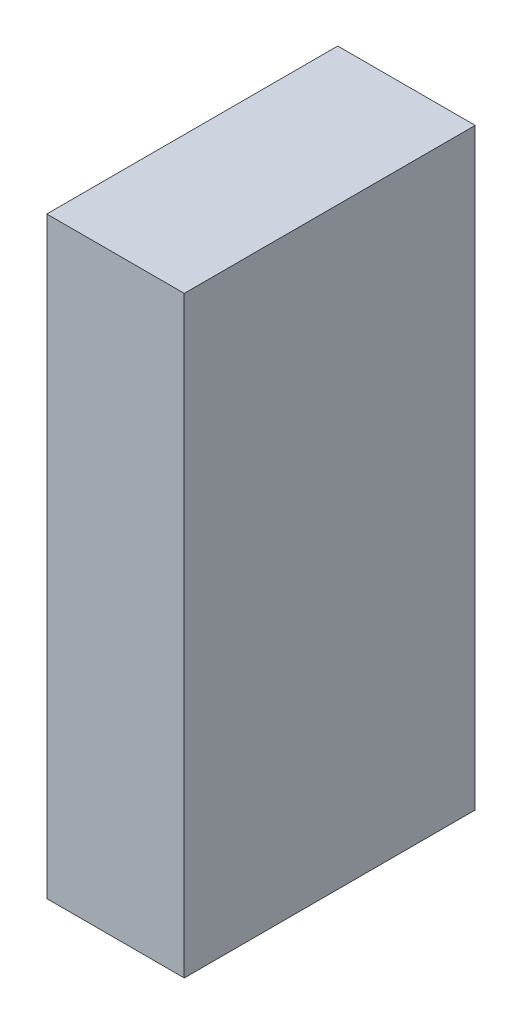
ISO-10303-21;
HEADER;
FILE_DESCRIPTION(('STEP AP214'),'2;1');
FILE_NAME('part.step','',(''),(''),'','','');
FILE_SCHEMA(('AUTOMOTIVE_DESIGN { 1 0 10303 214 1 1 1 1 }'));
ENDSEC;
DATA;
#1=APPLICATION_CONTEXT('core data for automotive mechanical design processes');
#2=APPLICATION_PROTOCOL_DEFINITION('international standard','automotive_design',2000,#1);
#3=PRODUCT_CONTEXT('',#1,'mechanical');
#4=PRODUCT('Part','Part','',(#3));
#5=PRODUCT_RELATED_PRODUCT_CATEGORY('part','',(#4));
#6=PRODUCT_DEFINITION_FORMATION('','',#4);
#7=PRODUCT_DEFINITION_CONTEXT('part definition',#1,'design');
#8=PRODUCT_DEFINITION('design','',#6,#7);
#9=PRODUCT_DEFINITION_SHAPE('','',#8);
#10=(LENGTH_UNIT() NAMED_UNIT(*) SI_UNIT(.MILLI.,.METRE.));
#11=(NAMED_UNIT(*) PLANE_ANGLE_UNIT() SI_UNIT($,.RADIAN.));
#12=(NAMED_UNIT(*) SI_UNIT($,.STERADIAN.) SOLID_ANGLE_UNIT());
#13=UNCERTAINTY_MEASURE_WITH_UNIT(LENGTH_MEASURE(1.E-05),#10,'distance_accuracy_value','');
#14=(GEOMETRIC_REPRESENTATION_CONTEXT(3) GLOBAL_UNCERTAINTY_ASSIGNED_CONTEXT((#13)) GLOBAL_UNIT_ASSIGNED_CONTEXT((#10,
#11,#12)) REPRESENTATION_CONTEXT('',''));
#15=CARTESIAN_POINT('',(0.,0.,0.));
#16=DIRECTION('',(0.,0.,1.));
#17=DIRECTION('',(1.,0.,0.));
#18=AXIS2_PLACEMENT_3D('',#15,#16,#17);
#19=CARTESIAN_POINT('',(49.28,-47.82,2.75));
#20=DIRECTION('',(0.,0.,-1.));
#21=DIRECTION('',(-1.,0.,0.));
#22=AXIS2_PLACEMENT_3D('',#19,#20,#21);
#23=PLANE('',#22);
#24=DIRECTION('',(0.,1.,0.));
#25=VECTOR('',#24,1.);
#26=CARTESIAN_POINT('',(-16.9754999999996,1.51000000000001,2.75));
#27=LINE('',#26,#25);
#28=CARTESIAN_POINT('',(-16.9754999999996,1.51000000000001,2.74999999999997));
#29=VERTEX_POINT('',#28);
#30=CARTESIAN_POINT('',(-16.9754999999996,14.45,2.75));
#31=VERTEX_POINT('',#30);
#32=EDGE_CURVE('E80',#29,#31,#27,.T.);
#33=ORIENTED_EDGE('',*,*,#32,.F.);
#34=DIRECTION('',(1.,0.,0.));
#35=VECTOR('',#34,1.);
#36=CARTESIAN_POINT('',(-19.9754999999996,1.51000000000001,2.75));
#37=LINE('',#36,#35);
#38=CARTESIAN_POINT('',(-19.9754999999996,1.51000000000001,2.75));
#39=VERTEX_POINT('',#38);
#40=EDGE_CURVE('E75',#39,#29,#37,.T.);
#41=ORIENTED_EDGE('',*,*,#40,.F.);
#42=DIRECTION('',(0.,-1.,0.));
#43=VECTOR('',#42,1.);
#44=CARTESIAN_POINT('',(-19.9754999999996,1.51000000000001,2.75));
#45=LINE('',#44,#43);
#46=CARTESIAN_POINT('',(-19.9754999999996,14.45,2.74999999999997));
#47=VERTEX_POINT('',#46);
#48=EDGE_CURVE('E98',#47,#39,#45,.T.);
#49=ORIENTED_EDGE('',*,*,#48,.F.);
#50=DIRECTION('',(-1.,0.,0.));
#51=VECTOR('',#50,1.);
#52=CARTESIAN_POINT('',(-19.9754999999996,14.45,2.75));
#53=LINE('',#52,#51);
#54=EDGE_CURVE('E95',#31,#47,#53,.T.);
#55=ORIENTED_EDGE('',*,*,#54,.F.);
#56=EDGE_LOOP('',(#33,#41,#49,#55));
#57=FACE_BOUND('',#56,.T.);
#58=ADVANCED_FACE('F34',(#57),#23,.T.);
#59=CARTESIAN_POINT('',(-19.9754999999996,1.51000000000001,22.3832074439874));
#60=DIRECTION('',(1.,0.,0.));
#61=DIRECTION('',(0.,0.,-1.));
#62=AXIS2_PLACEMENT_3D('',#59,#60,#61);
#63=PLANE('',#62);
#64=DIRECTION('',(0.,-1.,0.));
#65=VECTOR('',#64,1.);
#66=CARTESIAN_POINT('',(-19.9754999999996,1.51000000000001,9.10000000000012));
#67=LINE('',#66,#65);
#68=CARTESIAN_POINT('',(-19.9754999999996,14.45,9.10000000000012));
#69=VERTEX_POINT('',#68);
#70=CARTESIAN_POINT('',(-19.9754999999996,1.51000000000001,9.10000000000012));
#71=VERTEX_POINT('',#70);
#72=EDGE_CURVE('E13',#69,#71,#67,.T.);
#73=ORIENTED_EDGE('',*,*,#72,.F.);
#74=DIRECTION('',(0.,0.,-1.));
#75=VECTOR('',#74,1.);
#76=CARTESIAN_POINT('',(-19.9754999999996,14.45,22.3832074439874));
#77=LINE('',#76,#75);
#78=EDGE_CURVE('E96',#69,#47,#77,.T.);
#79=ORIENTED_EDGE('',*,*,#78,.T.);
#80=ORIENTED_EDGE('',*,*,#48,.T.);
#81=DIRECTION('',(0.,0.,-1.));
#82=VECTOR('',#81,1.);
#83=CARTESIAN_POINT('',(-19.9754999999996,1.51000000000001,22.3832074439874));
#84=LINE('',#83,#82);
#85=EDGE_CURVE('E51',#71,#39,#84,.T.);
#86=ORIENTED_EDGE('',*,*,#85,.F.);
#87=EDGE_LOOP('',(#73,#79,#80,#86));
#88=FACE_BOUND('',#87,.T.);
#89=ADVANCED_FACE('F108',(#88),#63,.F.);
#90=CARTESIAN_POINT('',(-16.9754999999996,1.51000000000001,22.3832074439874));
#91=DIRECTION('',(-1.,0.,0.));
#92=DIRECTION('',(0.,0.,1.));
#93=AXIS2_PLACEMENT_3D('',#90,#91,#92);
#94=PLANE('',#93);
#95=DIRECTION('',(0.,1.,0.));
#96=VECTOR('',#95,1.);
#97=CARTESIAN_POINT('',(-16.9754999999996,1.51000000000001,9.10000000000012));
#98=LINE('',#97,#96);
#99=CARTESIAN_POINT('',(-16.9754999999996,1.51000000000001,9.10000000000012));
#100=VERTEX_POINT('',#99);
#101=CARTESIAN_POINT('',(-16.9754999999996,14.45,9.10000000000012));
#102=VERTEX_POINT('',#101);
#103=EDGE_CURVE('E44',#100,#102,#98,.T.);
#104=ORIENTED_EDGE('',*,*,#103,.F.);
#105=DIRECTION('',(0.,0.,-1.));
#106=VECTOR('',#105,1.);
#107=CARTESIAN_POINT('',(-16.9754999999996,1.51000000000001,22.3832074439874));
#108=LINE('',#107,#106);
#109=EDGE_CURVE('E38',#100,#29,#108,.T.);
#110=ORIENTED_EDGE('',*,*,#109,.T.);
#111=ORIENTED_EDGE('',*,*,#32,.T.);
#112=DIRECTION('',(0.,0.,-1.));
#113=VECTOR('',#112,1.);
#114=CARTESIAN_POINT('',(-16.9754999999996,14.45,22.3832074439874));
#115=LINE('',#114,#113);
#116=EDGE_CURVE('E89',#102,#31,#115,.T.);
#117=ORIENTED_EDGE('',*,*,#116,.F.);
#118=EDGE_LOOP('',(#104,#110,#111,#117));
#119=FACE_BOUND('',#118,.T.);
#120=ADVANCED_FACE('F88',(#119),#94,.F.);
#121=CARTESIAN_POINT('',(0.,0.,9.10000000000012));
#122=DIRECTION('',(0.,0.,1.));
#123=DIRECTION('',(1.,0.,0.));
#124=AXIS2_PLACEMENT_3D('',#121,#122,#123);
#125=PLANE('',#124);
#126=ORIENTED_EDGE('',*,*,#72,.T.);
#127=DIRECTION('',(1.,0.,0.));
#128=VECTOR('',#127,1.);
#129=CARTESIAN_POINT('',(-19.9754999999996,1.51000000000001,9.10000000000012));
#130=LINE('',#129,#128);
#131=EDGE_CURVE('E73',#71,#100,#130,.T.);
#132=ORIENTED_EDGE('',*,*,#131,.T.);
#133=ORIENTED_EDGE('',*,*,#103,.T.);
#134=DIRECTION('',(-1.,0.,0.));
#135=VECTOR('',#134,1.);
#136=CARTESIAN_POINT('',(-19.9754999999996,14.45,9.10000000000012));
#137=LINE('',#136,#135);
#138=EDGE_CURVE('E81',#102,#69,#137,.T.);
#139=ORIENTED_EDGE('',*,*,#138,.T.);
#140=EDGE_LOOP('',(#126,#132,#133,#139));
#141=FACE_BOUND('',#140,.T.);
#142=ADVANCED_FACE('F36',(#141),#125,.T.);
#143=CARTESIAN_POINT('',(-19.9754999999996,14.45,-261.431701786115));
#144=DIRECTION('',(0.,1.,0.));
#145=DIRECTION('',(0.,0.,1.));
#146=AXIS2_PLACEMENT_3D('',#143,#144,#145);
#147=PLANE('',#146);
#148=ORIENTED_EDGE('',*,*,#78,.F.);
#149=ORIENTED_EDGE('',*,*,#138,.F.);
#150=ORIENTED_EDGE('',*,*,#116,.T.);
#151=ORIENTED_EDGE('',*,*,#54,.T.);
#152=EDGE_LOOP('',(#148,#149,#150,#151));
#153=FACE_BOUND('',#152,.T.);
#154=ADVANCED_FACE('F107',(#153),#147,.T.);
#155=CARTESIAN_POINT('',(-19.9754999999996,1.51000000000001,-261.431701786115));
#156=DIRECTION('',(0.,-1.,0.));
#157=DIRECTION('',(0.,0.,-1.));
#158=AXIS2_PLACEMENT_3D('',#155,#156,#157);
#159=PLANE('',#158);
#160=ORIENTED_EDGE('',*,*,#109,.F.);
#161=ORIENTED_EDGE('',*,*,#131,.F.);
#162=ORIENTED_EDGE('',*,*,#85,.T.);
#163=ORIENTED_EDGE('',*,*,#40,.T.);
#164=EDGE_LOOP('',(#160,#161,#162,#163));
#165=FACE_BOUND('',#164,.T.);
#166=ADVANCED_FACE('F72',(#165),#159,.T.);
#167=CLOSED_SHELL('',(#58,#89,#120,#142,#154,#166));
#168=MANIFOLD_SOLID_BREP('B2',#167);
#169=ADVANCED_BREP_SHAPE_REPRESENTATION('',(#18,#168),#14);
#170=SHAPE_DEFINITION_REPRESENTATION(#9,#169);
ENDSEC;
END-ISO-10303-21;
